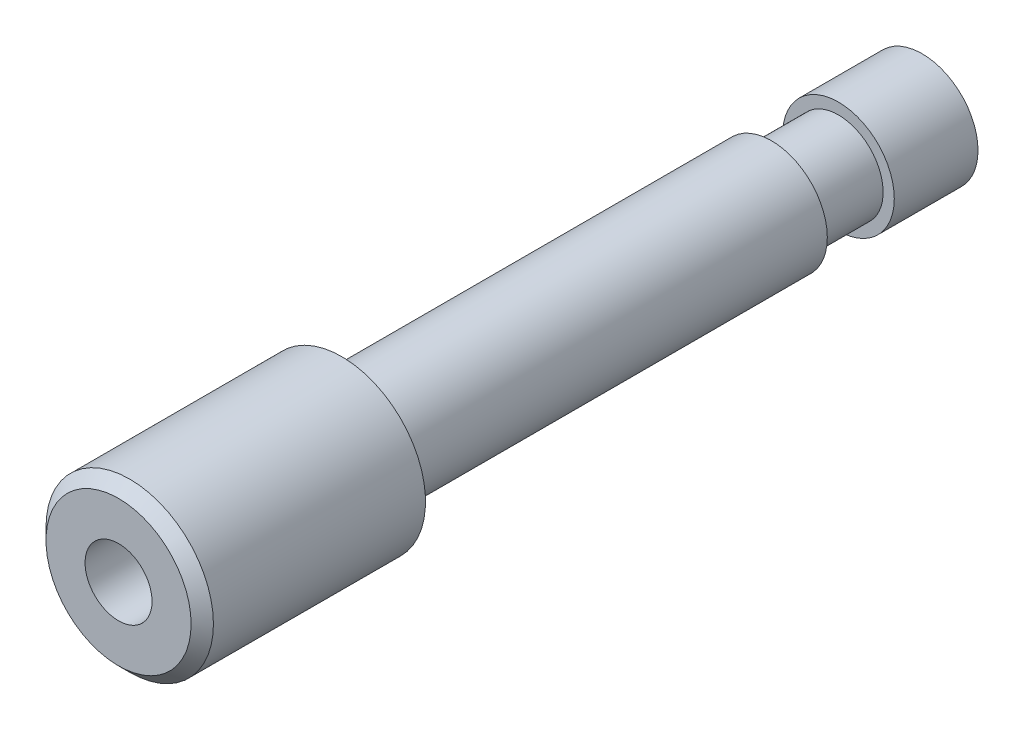
ISO-10303-21;
HEADER;
FILE_DESCRIPTION(('STEP AP214'),'2;1');
FILE_NAME('part.step','',(''),(''),'','','');
FILE_SCHEMA(('AUTOMOTIVE_DESIGN { 1 0 10303 214 1 1 1 1 }'));
ENDSEC;
DATA;
#1=APPLICATION_CONTEXT('core data for automotive mechanical design processes');
#2=APPLICATION_PROTOCOL_DEFINITION('international standard','automotive_design',2000,#1);
#3=PRODUCT_CONTEXT('',#1,'mechanical');
#4=PRODUCT('Part','Part','',(#3));
#5=PRODUCT_RELATED_PRODUCT_CATEGORY('part','',(#4));
#6=PRODUCT_DEFINITION_FORMATION('','',#4);
#7=PRODUCT_DEFINITION_CONTEXT('part definition',#1,'design');
#8=PRODUCT_DEFINITION('design','',#6,#7);
#9=PRODUCT_DEFINITION_SHAPE('','',#8);
#10=(LENGTH_UNIT() NAMED_UNIT(*) SI_UNIT(.MILLI.,.METRE.));
#11=(NAMED_UNIT(*) PLANE_ANGLE_UNIT() SI_UNIT($,.RADIAN.));
#12=(NAMED_UNIT(*) SI_UNIT($,.STERADIAN.) SOLID_ANGLE_UNIT());
#13=UNCERTAINTY_MEASURE_WITH_UNIT(LENGTH_MEASURE(1.E-05),#10,'distance_accuracy_value','');
#14=(GEOMETRIC_REPRESENTATION_CONTEXT(3) GLOBAL_UNCERTAINTY_ASSIGNED_CONTEXT((#13)) GLOBAL_UNIT_ASSIGNED_CONTEXT((#10,
#11,#12)) REPRESENTATION_CONTEXT('',''));
#15=CARTESIAN_POINT('',(0.,0.,0.));
#16=DIRECTION('',(0.,0.,1.));
#17=DIRECTION('',(1.,0.,0.));
#18=AXIS2_PLACEMENT_3D('',#15,#16,#17);
#19=CARTESIAN_POINT('',(0.,0.,-10.5));
#20=DIRECTION('',(0.,0.,1.));
#21=DIRECTION('',(1.,0.,0.));
#22=AXIS2_PLACEMENT_3D('',#19,#20,#21);
#23=CYLINDRICAL_SURFACE('',#22,2.5);
#24=CARTESIAN_POINT('',(0.,0.,-3.75));
#25=DIRECTION('',(0.,0.,-1.));
#26=DIRECTION('',(-1.,0.,0.));
#27=AXIS2_PLACEMENT_3D('',#24,#25,#26);
#28=CIRCLE('',#27,2.5);
#29=CARTESIAN_POINT('',(2.5,0.,-3.75));
#30=VERTEX_POINT('',#29);
#31=EDGE_CURVE('E91',#30,#30,#28,.T.);
#32=CARTESIAN_POINT('',(0.,0.,15.5));
#33=DIRECTION('',(0.,0.,-1.));
#34=DIRECTION('',(-1.,0.,0.));
#35=AXIS2_PLACEMENT_3D('',#32,#33,#34);
#36=CIRCLE('',#35,2.5);
#37=CARTESIAN_POINT('',(2.5,0.,15.5));
#38=VERTEX_POINT('',#37);
#39=EDGE_CURVE('E97',#38,#38,#36,.T.);
#40=CARTESIAN_POINT('',(2.5,0.,-3.75));
#41=CARTESIAN_POINT('',(2.5,0.,-3.54947916666666));
#42=CARTESIAN_POINT('',(2.5,0.,-3.34895833333333));
#43=CARTESIAN_POINT('',(2.5,0.,-2.94791666666666));
#44=CARTESIAN_POINT('',(2.5,0.,-2.74739583333333));
#45=CARTESIAN_POINT('',(2.5,0.,-2.34635416666667));
#46=CARTESIAN_POINT('',(2.5,0.,-2.14583333333333));
#47=CARTESIAN_POINT('',(2.5,0.,-1.74479166666667));
#48=CARTESIAN_POINT('',(2.5,0.,-1.54427083333333));
#49=CARTESIAN_POINT('',(2.5,0.,-1.14322916666666));
#50=CARTESIAN_POINT('',(2.5,0.,-0.942708333333331));
#51=CARTESIAN_POINT('',(2.5,0.,-0.541666666666665));
#52=CARTESIAN_POINT('',(2.5,0.,-0.341145833333332));
#53=CARTESIAN_POINT('',(2.5,0.,0.0598958333333348));
#54=CARTESIAN_POINT('',(2.5,0.,0.260416666666668));
#55=CARTESIAN_POINT('',(2.5,0.,0.661458333333334));
#56=CARTESIAN_POINT('',(2.5,0.,0.861979166666668));
#57=CARTESIAN_POINT('',(2.5,0.,1.26302083333333));
#58=CARTESIAN_POINT('',(2.5,0.,1.46354166666667));
#59=CARTESIAN_POINT('',(2.5,0.,1.86458333333333));
#60=CARTESIAN_POINT('',(2.5,0.,2.06510416666667));
#61=CARTESIAN_POINT('',(2.5,0.,2.46614583333333));
#62=CARTESIAN_POINT('',(2.5,0.,2.66666666666667));
#63=CARTESIAN_POINT('',(2.5,0.,3.06770833333333));
#64=CARTESIAN_POINT('',(2.5,0.,3.26822916666667));
#65=CARTESIAN_POINT('',(2.5,0.,3.66927083333333));
#66=CARTESIAN_POINT('',(2.5,0.,3.86979166666667));
#67=CARTESIAN_POINT('',(2.5,0.,4.27083333333333));
#68=CARTESIAN_POINT('',(2.5,0.,4.47135416666667));
#69=CARTESIAN_POINT('',(2.5,0.,4.87239583333333));
#70=CARTESIAN_POINT('',(2.5,0.,5.07291666666667));
#71=CARTESIAN_POINT('',(2.5,0.,5.47395833333333));
#72=CARTESIAN_POINT('',(2.5,0.,5.67447916666666));
#73=CARTESIAN_POINT('',(2.5,0.,6.07552083333333));
#74=CARTESIAN_POINT('',(2.5,0.,6.27604166666666));
#75=CARTESIAN_POINT('',(2.5,0.,6.67708333333333));
#76=CARTESIAN_POINT('',(2.5,0.,6.87760416666666));
#77=CARTESIAN_POINT('',(2.5,0.,7.27864583333333));
#78=CARTESIAN_POINT('',(2.5,0.,7.47916666666666));
#79=CARTESIAN_POINT('',(2.5,0.,7.88020833333333));
#80=CARTESIAN_POINT('',(2.5,0.,8.08072916666666));
#81=CARTESIAN_POINT('',(2.5,0.,8.48177083333333));
#82=CARTESIAN_POINT('',(2.5,0.,8.68229166666666));
#83=CARTESIAN_POINT('',(2.5,0.,9.08333333333333));
#84=CARTESIAN_POINT('',(2.5,0.,9.28385416666666));
#85=CARTESIAN_POINT('',(2.5,0.,9.68489583333333));
#86=CARTESIAN_POINT('',(2.5,0.,9.88541666666666));
#87=CARTESIAN_POINT('',(2.5,0.,10.2864583333333));
#88=CARTESIAN_POINT('',(2.5,0.,10.4869791666667));
#89=CARTESIAN_POINT('',(2.5,0.,10.8880208333333));
#90=CARTESIAN_POINT('',(2.5,0.,11.0885416666667));
#91=CARTESIAN_POINT('',(2.5,0.,11.4895833333333));
#92=CARTESIAN_POINT('',(2.5,0.,11.6901041666667));
#93=CARTESIAN_POINT('',(2.5,0.,12.0911458333333));
#94=CARTESIAN_POINT('',(2.5,0.,12.2916666666667));
#95=CARTESIAN_POINT('',(2.5,0.,12.6927083333333));
#96=CARTESIAN_POINT('',(2.5,0.,12.8932291666667));
#97=CARTESIAN_POINT('',(2.5,0.,13.2942708333333));
#98=CARTESIAN_POINT('',(2.5,0.,13.4947916666667));
#99=CARTESIAN_POINT('',(2.5,0.,13.8958333333333));
#100=CARTESIAN_POINT('',(2.5,0.,14.0963541666667));
#101=CARTESIAN_POINT('',(2.5,0.,14.4973958333333));
#102=CARTESIAN_POINT('',(2.5,0.,14.6979166666667));
#103=CARTESIAN_POINT('',(2.5,0.,15.0989583333333));
#104=CARTESIAN_POINT('',(2.5,0.,15.2994791666667));
#105=CARTESIAN_POINT('',(2.5,0.,15.5));
#106=B_SPLINE_CURVE_WITH_KNOTS('',3,(#40,#41,#42,#43,#44,#45,#46,#47,#48,#49,#50,#51,#52,#53,
#54,#55,#56,#57,#58,#59,#60,#61,#62,#63,#64,#65,#66,#67,#68,#69,#70,#71,#72,#73,#74,#75,#76,#77,
#78,#79,#80,#81,#82,#83,#84,#85,#86,#87,#88,#89,#90,#91,#92,#93,#94,#95,#96,#97,#98,#99,#100,
#101,#102,#103,#104,#105),.UNSPECIFIED.,.F.,.F.,(4,2,2,2,2,2,2,2,2,2,2,2,2,2,2,2,2,2,2,2,2,2,2,
2,2,2,2,2,2,2,2,2,4),(0.,0.6015625,1.203125,1.8046875,2.40625,3.0078125,3.609375,4.2109375,
4.8125,5.4140625,6.015625,6.6171875,7.21875,7.8203125,8.421875,9.02343749999999,
9.62499999999999,10.2265625,10.828125,11.4296875,12.03125,12.6328125,13.234375,13.8359375,
14.4375,15.0390625,15.640625,16.2421875,16.84375,17.4453125,18.046875,18.6484375,19.25),.UNSPECIFIED.);
#107=EDGE_CURVE('BSEAM37',#30,#38,#106,.T.);
#108=ORIENTED_EDGE('',*,*,#31,.F.);
#109=ORIENTED_EDGE('',*,*,#39,.T.);
#110=ORIENTED_EDGE('',*,*,#107,.T.);
#111=ORIENTED_EDGE('',*,*,#107,.F.);
#112=EDGE_LOOP('',(#108,#110,#109,#111));
#113=FACE_BOUND('',#112,.T.);
#114=ADVANCED_FACE('F37',(#113),#23,.T.);
#115=CARTESIAN_POINT('',(2.,0.,-3.75));
#116=DIRECTION('',(0.,0.,-1.));
#117=DIRECTION('',(-1.,0.,0.));
#118=AXIS2_PLACEMENT_3D('',#115,#116,#117);
#119=PLANE('',#118);
#120=CARTESIAN_POINT('',(0.,0.,-3.75));
#121=DIRECTION('',(0.,0.,-1.));
#122=DIRECTION('',(-1.,0.,0.));
#123=AXIS2_PLACEMENT_3D('',#120,#121,#122);
#124=CIRCLE('',#123,2.);
#125=CARTESIAN_POINT('',(-2.,0.,-3.75));
#126=VERTEX_POINT('',#125);
#127=EDGE_CURVE('E92',#126,#126,#124,.T.);
#128=ORIENTED_EDGE('',*,*,#127,.F.);
#129=EDGE_LOOP('',(#128));
#130=FACE_BOUND('',#129,.T.);
#131=ORIENTED_EDGE('',*,*,#31,.T.);
#132=EDGE_LOOP('',(#131));
#133=FACE_BOUND('',#132,.T.);
#134=ADVANCED_FACE('F113',(#130,#133),#119,.T.);
#135=CARTESIAN_POINT('',(2.,0.,-6.75));
#136=DIRECTION('',(0.,0.,1.));
#137=DIRECTION('',(1.,0.,0.));
#138=AXIS2_PLACEMENT_3D('',#135,#136,#137);
#139=PLANE('',#138);
#140=CARTESIAN_POINT('',(0.,0.,-6.75));
#141=DIRECTION('',(0.,0.,-1.));
#142=DIRECTION('',(-1.,0.,0.));
#143=AXIS2_PLACEMENT_3D('',#140,#141,#142);
#144=CIRCLE('',#143,2.);
#145=CARTESIAN_POINT('',(-2.,0.,-6.75));
#146=VERTEX_POINT('',#145);
#147=EDGE_CURVE('E165',#146,#146,#144,.T.);
#148=ORIENTED_EDGE('',*,*,#147,.T.);
#149=EDGE_LOOP('',(#148));
#150=FACE_BOUND('',#149,.T.);
#151=CARTESIAN_POINT('',(0.,0.,-6.75));
#152=DIRECTION('',(0.,0.,1.));
#153=DIRECTION('',(1.,0.,0.));
#154=AXIS2_PLACEMENT_3D('',#151,#152,#153);
#155=CIRCLE('',#154,2.5);
#156=CARTESIAN_POINT('',(2.5,0.,-6.75));
#157=VERTEX_POINT('',#156);
#158=EDGE_CURVE('E88',#157,#157,#155,.T.);
#159=ORIENTED_EDGE('',*,*,#158,.T.);
#160=EDGE_LOOP('',(#159));
#161=FACE_BOUND('',#160,.T.);
#162=ADVANCED_FACE('F119',(#150,#161),#139,.T.);
#163=CARTESIAN_POINT('',(0.,0.,-10.5));
#164=DIRECTION('',(0.,0.,-1.));
#165=DIRECTION('',(-1.,0.,0.));
#166=AXIS2_PLACEMENT_3D('',#163,#164,#165);
#167=CYLINDRICAL_SURFACE('',#166,2.);
#168=ORIENTED_EDGE('',*,*,#127,.T.);
#169=EDGE_LOOP('',(#168));
#170=FACE_BOUND('',#169,.T.);
#171=ORIENTED_EDGE('',*,*,#147,.F.);
#172=EDGE_LOOP('',(#171));
#173=FACE_BOUND('',#172,.T.);
#174=ADVANCED_FACE('F133',(#170,#173),#167,.T.);
#175=CARTESIAN_POINT('',(0.,0.,-10.5));
#176=DIRECTION('',(0.,0.,-1.));
#177=DIRECTION('',(-1.,0.,0.));
#178=AXIS2_PLACEMENT_3D('',#175,#176,#177);
#179=PLANE('',#178);
#180=DIRECTION('',(1.,0.,0.));
#181=VECTOR('',#180,1.);
#182=CARTESIAN_POINT('',(2.54148885727833,-2.,-10.5));
#183=LINE('',#182,#181);
#184=CARTESIAN_POINT('',(-1.5,-2.,-10.5));
#185=VERTEX_POINT('',#184);
#186=CARTESIAN_POINT('',(1.5,-2.,-10.5));
#187=VERTEX_POINT('',#186);
#188=EDGE_CURVE('E66',#185,#187,#183,.T.);
#189=ORIENTED_EDGE('',*,*,#188,.F.);
#190=CARTESIAN_POINT('',(0.,0.,-10.5));
#191=DIRECTION('',(0.,0.,-1.));
#192=DIRECTION('',(-1.,0.,0.));
#193=AXIS2_PLACEMENT_3D('',#190,#191,#192);
#194=CIRCLE('',#193,2.5);
#195=EDGE_CURVE('E75',#185,#187,#194,.T.);
#196=ORIENTED_EDGE('',*,*,#195,.T.);
#197=EDGE_LOOP('',(#189,#196));
#198=FACE_BOUND('',#197,.T.);
#199=ADVANCED_FACE('F74',(#198),#179,.T.);
#200=ORIENTED_EDGE('',*,*,#195,.F.);
#201=DIRECTION('',(0.,0.,1.));
#202=VECTOR('',#201,1.);
#203=CARTESIAN_POINT('',(-1.5,-2.,-10.5));
#204=LINE('',#203,#202);
#205=CARTESIAN_POINT('',(-1.5,-2.,-8.5));
#206=VERTEX_POINT('',#205);
#207=EDGE_CURVE('E63',#185,#206,#204,.T.);
#208=ORIENTED_EDGE('',*,*,#207,.T.);
#209=CARTESIAN_POINT('',(0.,0.,-8.5));
#210=DIRECTION('',(0.,0.,-1.));
#211=DIRECTION('',(-1.,0.,0.));
#212=AXIS2_PLACEMENT_3D('',#209,#210,#211);
#213=CIRCLE('',#212,2.5);
#214=CARTESIAN_POINT('',(1.5,-2.,-8.5));
#215=VERTEX_POINT('',#214);
#216=EDGE_CURVE('E55',#215,#206,#213,.T.);
#217=ORIENTED_EDGE('',*,*,#216,.F.);
#218=DIRECTION('',(0.,0.,1.));
#219=VECTOR('',#218,1.);
#220=CARTESIAN_POINT('',(1.5,-2.,-10.5));
#221=LINE('',#220,#219);
#222=EDGE_CURVE('E70',#215,#187,#221,.F.);
#223=ORIENTED_EDGE('',*,*,#222,.T.);
#224=EDGE_LOOP('',(#200,#208,#217,#223));
#225=FACE_BOUND('',#224,.T.);
#226=ORIENTED_EDGE('',*,*,#158,.F.);
#227=EDGE_LOOP('',(#226));
#228=FACE_BOUND('',#227,.T.);
#229=ADVANCED_FACE('F78',(#225,#228),#23,.T.);
#230=CARTESIAN_POINT('',(2.54148885727833,-2.,-8.5));
#231=DIRECTION('',(0.,1.,0.));
#232=DIRECTION('',(0.,0.,1.));
#233=AXIS2_PLACEMENT_3D('',#230,#231,#232);
#234=PLANE('',#233);
#235=ORIENTED_EDGE('',*,*,#188,.T.);
#236=ORIENTED_EDGE('',*,*,#222,.F.);
#237=DIRECTION('',(1.,0.,0.));
#238=VECTOR('',#237,1.);
#239=CARTESIAN_POINT('',(2.54148885727833,-2.,-8.5));
#240=LINE('',#239,#238);
#241=EDGE_CURVE('E51',#206,#215,#240,.T.);
#242=ORIENTED_EDGE('',*,*,#241,.F.);
#243=ORIENTED_EDGE('',*,*,#207,.F.);
#244=EDGE_LOOP('',(#235,#236,#242,#243));
#245=FACE_BOUND('',#244,.T.);
#246=ADVANCED_FACE('F65',(#245),#234,.F.);
#247=CARTESIAN_POINT('',(-2.60470997313103,-2.98624940730204,-8.5));
#248=DIRECTION('',(0.,0.,-1.));
#249=DIRECTION('',(-1.,0.,0.));
#250=AXIS2_PLACEMENT_3D('',#247,#248,#249);
#251=PLANE('',#250);
#252=ORIENTED_EDGE('',*,*,#216,.T.);
#253=ORIENTED_EDGE('',*,*,#241,.T.);
#254=EDGE_LOOP('',(#252,#253));
#255=FACE_BOUND('',#254,.T.);
#256=ADVANCED_FACE('F131',(#255),#251,.T.);
#257=CARTESIAN_POINT('',(0.,0.,15.5));
#258=DIRECTION('',(0.,0.,-1.));
#259=DIRECTION('',(-1.,0.,0.));
#260=AXIS2_PLACEMENT_3D('',#257,#258,#259);
#261=PLANE('',#260);
#262=ORIENTED_EDGE('',*,*,#39,.F.);
#263=EDGE_LOOP('',(#262));
#264=FACE_BOUND('',#263,.T.);
#265=CARTESIAN_POINT('',(0.,0.,15.5));
#266=DIRECTION('',(0.,0.,-1.));
#267=DIRECTION('',(-1.,0.,0.));
#268=AXIS2_PLACEMENT_3D('',#265,#266,#267);
#269=CIRCLE('',#268,3.75);
#270=CARTESIAN_POINT('',(-3.75,0.,15.5));
#271=VERTEX_POINT('',#270);
#272=EDGE_CURVE('E76',#271,#271,#269,.T.);
#273=ORIENTED_EDGE('',*,*,#272,.T.);
#274=EDGE_LOOP('',(#273));
#275=FACE_BOUND('',#274,.T.);
#276=ADVANCED_FACE('F146',(#264,#275),#261,.T.);
#277=CARTESIAN_POINT('',(0.,0.,17.5));
#278=DIRECTION('',(0.,0.,1.));
#279=DIRECTION('',(1.,0.,0.));
#280=AXIS2_PLACEMENT_3D('',#277,#278,#279);
#281=PLANE('',#280);
#282=CARTESIAN_POINT('',(0.,0.,17.5));
#283=DIRECTION('',(0.,0.,1.));
#284=DIRECTION('',(1.,0.,0.));
#285=AXIS2_PLACEMENT_3D('',#282,#283,#284);
#286=CIRCLE('',#285,1.5);
#287=CARTESIAN_POINT('',(1.5,0.,17.5));
#288=VERTEX_POINT('',#287);
#289=EDGE_CURVE('E80',#288,#288,#286,.T.);
#290=ORIENTED_EDGE('',*,*,#289,.T.);
#291=EDGE_LOOP('',(#290));
#292=FACE_BOUND('',#291,.T.);
#293=ADVANCED_FACE('F143',(#292),#281,.T.);
#294=CARTESIAN_POINT('',(0.,0.,17.5));
#295=DIRECTION('',(0.,0.,1.));
#296=DIRECTION('',(1.,0.,0.));
#297=AXIS2_PLACEMENT_3D('',#294,#295,#296);
#298=CYLINDRICAL_SURFACE('',#297,1.5);
#299=ORIENTED_EDGE('',*,*,#289,.F.);
#300=EDGE_LOOP('',(#299));
#301=FACE_BOUND('',#300,.T.);
#302=CARTESIAN_POINT('',(0.,0.,25.5));
#303=DIRECTION('',(0.,0.,1.));
#304=DIRECTION('',(1.,0.,0.));
#305=AXIS2_PLACEMENT_3D('',#302,#303,#304);
#306=CIRCLE('',#305,1.5);
#307=CARTESIAN_POINT('',(1.5,0.,25.5));
#308=VERTEX_POINT('',#307);
#309=EDGE_CURVE('E84',#308,#308,#306,.T.);
#310=ORIENTED_EDGE('',*,*,#309,.T.);
#311=EDGE_LOOP('',(#310));
#312=FACE_BOUND('',#311,.T.);
#313=ADVANCED_FACE('F140',(#301,#312),#298,.F.);
#314=CARTESIAN_POINT('',(0.,0.,25.5));
#315=DIRECTION('',(0.,0.,1.));
#316=DIRECTION('',(1.,0.,0.));
#317=AXIS2_PLACEMENT_3D('',#314,#315,#316);
#318=PLANE('',#317);
#319=CARTESIAN_POINT('',(0.,0.,25.5));
#320=DIRECTION('',(0.,0.,1.));
#321=DIRECTION('',(1.,0.,0.));
#322=AXIS2_PLACEMENT_3D('',#319,#320,#321);
#323=CIRCLE('',#322,3.25);
#324=CARTESIAN_POINT('',(3.25,0.,25.5));
#325=VERTEX_POINT('',#324);
#326=EDGE_CURVE('E45',#325,#325,#323,.T.);
#327=ORIENTED_EDGE('',*,*,#326,.T.);
#328=EDGE_LOOP('',(#327));
#329=FACE_BOUND('',#328,.T.);
#330=ORIENTED_EDGE('',*,*,#309,.F.);
#331=EDGE_LOOP('',(#330));
#332=FACE_BOUND('',#331,.T.);
#333=ADVANCED_FACE('F101',(#329,#332),#318,.T.);
#334=CARTESIAN_POINT('',(0.,0.,25.5));
#335=DIRECTION('',(0.,0.,-1.));
#336=DIRECTION('',(-1.,0.,0.));
#337=AXIS2_PLACEMENT_3D('',#334,#335,#336);
#338=CYLINDRICAL_SURFACE('',#337,3.75);
#339=CARTESIAN_POINT('',(0.,0.,25.));
#340=DIRECTION('',(0.,0.,1.));
#341=DIRECTION('',(1.,0.,0.));
#342=AXIS2_PLACEMENT_3D('',#339,#340,#341);
#343=CIRCLE('',#342,3.75);
#344=CARTESIAN_POINT('',(3.75,0.,25.));
#345=VERTEX_POINT('',#344);
#346=EDGE_CURVE('E12',#345,#345,#343,.F.);
#347=ORIENTED_EDGE('',*,*,#346,.T.);
#348=EDGE_LOOP('',(#347));
#349=FACE_BOUND('',#348,.T.);
#350=ORIENTED_EDGE('',*,*,#272,.F.);
#351=EDGE_LOOP('',(#350));
#352=FACE_BOUND('',#351,.T.);
#353=ADVANCED_FACE('F105',(#349,#352),#338,.T.);
#354=CARTESIAN_POINT('',(0.,0.,25.5));
#355=DIRECTION('',(0.,0.,-1.));
#356=DIRECTION('',(-1.,0.,0.));
#357=AXIS2_PLACEMENT_3D('',#354,#355,#356);
#358=CONICAL_SURFACE('',#357,3.25,0.785398163397442);
#359=ORIENTED_EDGE('',*,*,#346,.F.);
#360=EDGE_LOOP('',(#359));
#361=FACE_BOUND('',#360,.T.);
#362=ORIENTED_EDGE('',*,*,#326,.F.);
#363=EDGE_LOOP('',(#362));
#364=FACE_BOUND('',#363,.T.);
#365=ADVANCED_FACE('F39',(#361,#364),#358,.T.);
#366=CLOSED_SHELL('',(#114,#134,#162,#174,#199,#229,#246,#256,#276,#293,#313,#333,#353,#365));
#367=MANIFOLD_SOLID_BREP('B2',#366);
#368=ADVANCED_BREP_SHAPE_REPRESENTATION('',(#18,#367),#14);
#369=SHAPE_DEFINITION_REPRESENTATION(#9,#368);
ENDSEC;
END-ISO-10303-21;
